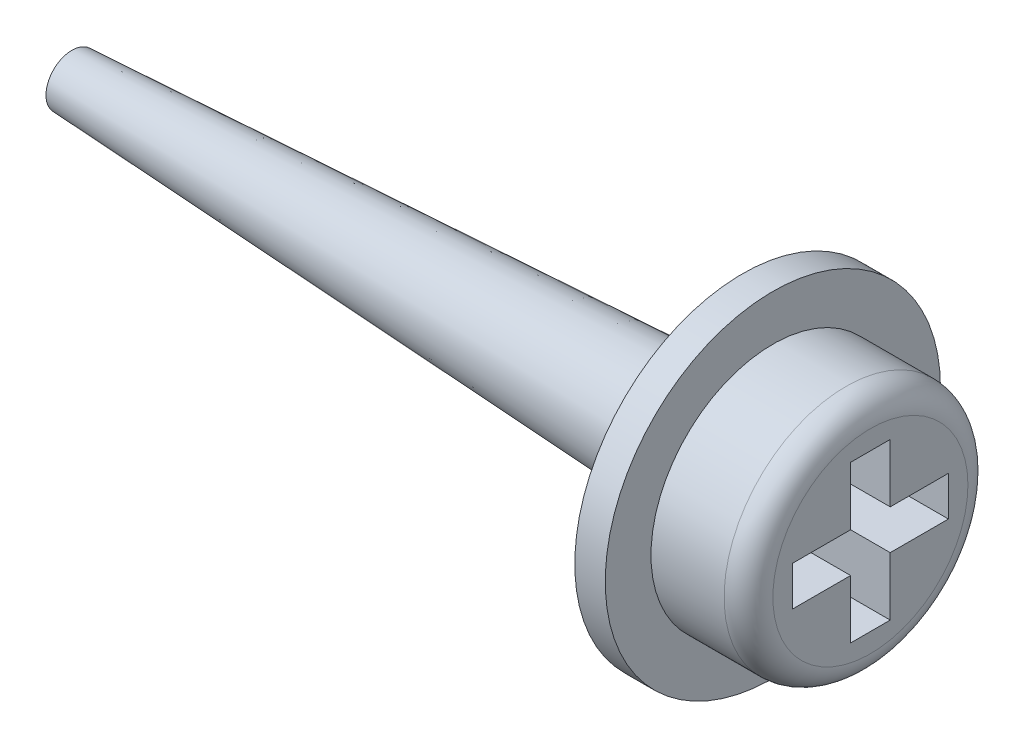
ISO-10303-21;
HEADER;
FILE_DESCRIPTION(('STEP AP214'),'2;1');
FILE_NAME('part.step','',(''),(''),'','','');
FILE_SCHEMA(('AUTOMOTIVE_DESIGN { 1 0 10303 214 1 1 1 1 }'));
ENDSEC;
DATA;
#1=APPLICATION_CONTEXT('core data for automotive mechanical design processes');
#2=APPLICATION_PROTOCOL_DEFINITION('international standard','automotive_design',2000,#1);
#3=PRODUCT_CONTEXT('',#1,'mechanical');
#4=PRODUCT('Part','Part','',(#3));
#5=PRODUCT_RELATED_PRODUCT_CATEGORY('part','',(#4));
#6=PRODUCT_DEFINITION_FORMATION('','',#4);
#7=PRODUCT_DEFINITION_CONTEXT('part definition',#1,'design');
#8=PRODUCT_DEFINITION('design','',#6,#7);
#9=PRODUCT_DEFINITION_SHAPE('','',#8);
#10=(LENGTH_UNIT() NAMED_UNIT(*) SI_UNIT(.MILLI.,.METRE.));
#11=(NAMED_UNIT(*) PLANE_ANGLE_UNIT() SI_UNIT($,.RADIAN.));
#12=(NAMED_UNIT(*) SI_UNIT($,.STERADIAN.) SOLID_ANGLE_UNIT());
#13=UNCERTAINTY_MEASURE_WITH_UNIT(LENGTH_MEASURE(1.E-05),#10,'distance_accuracy_value','');
#14=(GEOMETRIC_REPRESENTATION_CONTEXT(3) GLOBAL_UNCERTAINTY_ASSIGNED_CONTEXT((#13)) GLOBAL_UNIT_ASSIGNED_CONTEXT((#10,
#11,#12)) REPRESENTATION_CONTEXT('',''));
#15=CARTESIAN_POINT('',(0.,0.,0.));
#16=DIRECTION('',(0.,0.,1.));
#17=DIRECTION('',(1.,0.,0.));
#18=AXIS2_PLACEMENT_3D('',#15,#16,#17);
#19=CARTESIAN_POINT('',(-3.01819672131147,0.,0.));
#20=DIRECTION('',(-1.,0.,0.));
#21=DIRECTION('',(0.,0.,1.));
#22=AXIS2_PLACEMENT_3D('',#19,#20,#21);
#23=PLANE('',#22);
#24=CARTESIAN_POINT('',(-3.01819672131147,0.,0.));
#25=DIRECTION('',(-1.,0.,0.));
#26=DIRECTION('',(0.,0.,1.));
#27=AXIS2_PLACEMENT_3D('',#24,#25,#26);
#28=CIRCLE('',#27,0.51);
#29=CARTESIAN_POINT('',(-3.01819672131147,0.,0.51));
#30=VERTEX_POINT('',#29);
#31=EDGE_CURVE('E288',#30,#30,#28,.T.);
#32=ORIENTED_EDGE('',*,*,#31,.T.);
#33=EDGE_LOOP('',(#32));
#34=FACE_BOUND('',#33,.T.);
#35=ADVANCED_FACE('F41',(#34),#23,.T.);
#36=CARTESIAN_POINT('',(-3.01819672131147,0.,0.));
#37=DIRECTION('',(1.,0.,0.));
#38=DIRECTION('',(0.,0.,-1.));
#39=AXIS2_PLACEMENT_3D('',#36,#37,#38);
#40=CONICAL_SURFACE('',#39,0.51,0.0522251945142065);
#41=CARTESIAN_POINT('',(10.1818032786885,0.,0.));
#42=DIRECTION('',(-1.,0.,0.));
#43=DIRECTION('',(0.,0.,1.));
#44=AXIS2_PLACEMENT_3D('',#41,#42,#43);
#45=CIRCLE('',#44,1.2);
#46=CARTESIAN_POINT('',(10.1818032786885,0.,1.2));
#47=VERTEX_POINT('',#46);
#48=EDGE_CURVE('E293',#47,#47,#45,.T.);
#49=ORIENTED_EDGE('',*,*,#48,.T.);
#50=EDGE_LOOP('',(#49));
#51=FACE_BOUND('',#50,.T.);
#52=ORIENTED_EDGE('',*,*,#31,.F.);
#53=EDGE_LOOP('',(#52));
#54=FACE_BOUND('',#53,.T.);
#55=ADVANCED_FACE('F364',(#51,#54),#40,.T.);
#56=CARTESIAN_POINT('',(10.7818032786885,0.,0.));
#57=DIRECTION('',(-1.,0.,0.));
#58=DIRECTION('',(0.,0.,1.));
#59=AXIS2_PLACEMENT_3D('',#56,#57,#58);
#60=CYLINDRICAL_SURFACE('',#59,3.3);
#61=CARTESIAN_POINT('',(10.7818032786885,0.,0.));
#62=DIRECTION('',(1.,0.,0.));
#63=DIRECTION('',(0.,0.,-1.));
#64=AXIS2_PLACEMENT_3D('',#61,#62,#63);
#65=CIRCLE('',#64,3.3);
#66=CARTESIAN_POINT('',(10.7818032786885,0.,-3.3));
#67=VERTEX_POINT('',#66);
#68=EDGE_CURVE('E289',#67,#67,#65,.T.);
#69=ORIENTED_EDGE('',*,*,#68,.F.);
#70=EDGE_LOOP('',(#69));
#71=FACE_BOUND('',#70,.T.);
#72=CARTESIAN_POINT('',(10.1818032786885,0.,0.));
#73=DIRECTION('',(1.,0.,0.));
#74=DIRECTION('',(0.,0.,-1.));
#75=AXIS2_PLACEMENT_3D('',#72,#73,#74);
#76=CIRCLE('',#75,3.3);
#77=CARTESIAN_POINT('',(10.1818032786885,0.,-3.3));
#78=VERTEX_POINT('',#77);
#79=EDGE_CURVE('E255',#78,#78,#76,.T.);
#80=ORIENTED_EDGE('',*,*,#79,.T.);
#81=EDGE_LOOP('',(#80));
#82=FACE_BOUND('',#81,.T.);
#83=ADVANCED_FACE('F370',(#71,#82),#60,.T.);
#84=CARTESIAN_POINT('',(10.7818032786885,0.,0.));
#85=DIRECTION('',(1.,0.,0.));
#86=DIRECTION('',(0.,0.,-1.));
#87=AXIS2_PLACEMENT_3D('',#84,#85,#86);
#88=PLANE('',#87);
#89=CARTESIAN_POINT('',(10.7818032786885,0.,0.));
#90=DIRECTION('',(1.,0.,0.));
#91=DIRECTION('',(0.,0.,-1.));
#92=AXIS2_PLACEMENT_3D('',#89,#90,#91);
#93=CIRCLE('',#92,2.4);
#94=CARTESIAN_POINT('',(10.7818032786885,0.,-2.4));
#95=VERTEX_POINT('',#94);
#96=EDGE_CURVE('E283',#95,#95,#93,.T.);
#97=ORIENTED_EDGE('',*,*,#96,.F.);
#98=EDGE_LOOP('',(#97));
#99=FACE_BOUND('',#98,.T.);
#100=ORIENTED_EDGE('',*,*,#68,.T.);
#101=EDGE_LOOP('',(#100));
#102=FACE_BOUND('',#101,.T.);
#103=ADVANCED_FACE('F424',(#99,#102),#88,.T.);
#104=CARTESIAN_POINT('',(10.1818032786885,0.,0.));
#105=DIRECTION('',(1.,0.,0.));
#106=DIRECTION('',(0.,0.,-1.));
#107=AXIS2_PLACEMENT_3D('',#104,#105,#106);
#108=PLANE('',#107);
#109=ORIENTED_EDGE('',*,*,#48,.F.);
#110=EDGE_LOOP('',(#109));
#111=FACE_BOUND('',#110,.T.);
#112=ORIENTED_EDGE('',*,*,#79,.F.);
#113=EDGE_LOOP('',(#112));
#114=FACE_BOUND('',#113,.T.);
#115=ADVANCED_FACE('F422',(#111,#114),#108,.F.);
#116=CARTESIAN_POINT('',(12.7018032786885,0.,0.));
#117=DIRECTION('',(-1.,0.,0.));
#118=DIRECTION('',(0.,0.,1.));
#119=AXIS2_PLACEMENT_3D('',#116,#117,#118);
#120=CYLINDRICAL_SURFACE('',#119,2.4);
#121=CARTESIAN_POINT('',(12.2218032786885,0.,0.));
#122=DIRECTION('',(1.,0.,0.));
#123=DIRECTION('',(0.,0.,-1.));
#124=AXIS2_PLACEMENT_3D('',#121,#122,#123);
#125=CIRCLE('',#124,2.4);
#126=CARTESIAN_POINT('',(12.2218032786885,0.,-2.4));
#127=VERTEX_POINT('',#126);
#128=EDGE_CURVE('E11',#127,#127,#125,.F.);
#129=ORIENTED_EDGE('',*,*,#128,.T.);
#130=EDGE_LOOP('',(#129));
#131=FACE_BOUND('',#130,.T.);
#132=ORIENTED_EDGE('',*,*,#96,.T.);
#133=EDGE_LOOP('',(#132));
#134=FACE_BOUND('',#133,.T.);
#135=ADVANCED_FACE('F419',(#131,#134),#120,.T.);
#136=CARTESIAN_POINT('',(12.7018032786885,0.,0.));
#137=DIRECTION('',(1.,0.,0.));
#138=DIRECTION('',(0.,0.,-1.));
#139=AXIS2_PLACEMENT_3D('',#136,#137,#138);
#140=PLANE('',#139);
#141=CARTESIAN_POINT('',(12.7018032786885,0.,0.));
#142=DIRECTION('',(1.,0.,0.));
#143=DIRECTION('',(0.,0.,-1.));
#144=AXIS2_PLACEMENT_3D('',#141,#142,#143);
#145=CIRCLE('',#144,1.92);
#146=CARTESIAN_POINT('',(12.7018032786885,0.,-1.92));
#147=VERTEX_POINT('',#146);
#148=EDGE_CURVE('E50',#147,#147,#145,.T.);
#149=ORIENTED_EDGE('',*,*,#148,.T.);
#150=EDGE_LOOP('',(#149));
#151=FACE_BOUND('',#150,.T.);
#152=DIRECTION('',(0.,0.,-1.));
#153=VECTOR('',#152,1.);
#154=CARTESIAN_POINT('',(12.7018032786885,-0.39,-0.390000000000001));
#155=LINE('',#154,#153);
#156=CARTESIAN_POINT('',(12.7018032786885,-0.39,-0.390000000000001));
#157=VERTEX_POINT('',#156);
#158=CARTESIAN_POINT('',(12.7018032786885,-0.39,-1.536));
#159=VERTEX_POINT('',#158);
#160=EDGE_CURVE('E207',#157,#159,#155,.T.);
#161=ORIENTED_EDGE('',*,*,#160,.F.);
#162=DIRECTION('',(0.,1.,0.));
#163=VECTOR('',#162,1.);
#164=CARTESIAN_POINT('',(12.7018032786885,-1.54,-0.390000000000001));
#165=LINE('',#164,#163);
#166=CARTESIAN_POINT('',(12.7018032786885,-1.54,-0.390000000000001));
#167=VERTEX_POINT('',#166);
#168=EDGE_CURVE('E248',#167,#157,#165,.T.);
#169=ORIENTED_EDGE('',*,*,#168,.F.);
#170=DIRECTION('',(0.,0.,-1.));
#171=VECTOR('',#170,1.);
#172=CARTESIAN_POINT('',(12.7018032786885,-1.54,0.389999999999999));
#173=LINE('',#172,#171);
#174=CARTESIAN_POINT('',(12.7018032786885,-1.54,0.389999999999999));
#175=VERTEX_POINT('',#174);
#176=EDGE_CURVE('E244',#175,#167,#173,.T.);
#177=ORIENTED_EDGE('',*,*,#176,.F.);
#178=DIRECTION('',(0.,-1.,0.));
#179=VECTOR('',#178,1.);
#180=CARTESIAN_POINT('',(12.7018032786885,-1.54,0.389999999999999));
#181=LINE('',#180,#179);
#182=CARTESIAN_POINT('',(12.7018032786885,-0.39,0.39));
#183=VERTEX_POINT('',#182);
#184=EDGE_CURVE('E240',#183,#175,#181,.T.);
#185=ORIENTED_EDGE('',*,*,#184,.F.);
#186=DIRECTION('',(0.,0.,-1.));
#187=VECTOR('',#186,1.);
#188=CARTESIAN_POINT('',(12.7018032786885,-0.39,0.39));
#189=LINE('',#188,#187);
#190=CARTESIAN_POINT('',(12.7018032786885,-0.39,1.536));
#191=VERTEX_POINT('',#190);
#192=EDGE_CURVE('E236',#191,#183,#189,.T.);
#193=ORIENTED_EDGE('',*,*,#192,.F.);
#194=DIRECTION('',(0.,-1.,0.));
#195=VECTOR('',#194,1.);
#196=CARTESIAN_POINT('',(12.7018032786885,0.39,1.536));
#197=LINE('',#196,#195);
#198=CARTESIAN_POINT('',(12.7018032786885,0.39,1.536));
#199=VERTEX_POINT('',#198);
#200=EDGE_CURVE('E232',#199,#191,#197,.T.);
#201=ORIENTED_EDGE('',*,*,#200,.F.);
#202=DIRECTION('',(0.,0.,1.));
#203=VECTOR('',#202,1.);
#204=CARTESIAN_POINT('',(12.7018032786885,0.39,0.39));
#205=LINE('',#204,#203);
#206=CARTESIAN_POINT('',(12.7018032786885,0.39,0.39));
#207=VERTEX_POINT('',#206);
#208=EDGE_CURVE('E228',#207,#199,#205,.T.);
#209=ORIENTED_EDGE('',*,*,#208,.F.);
#210=DIRECTION('',(0.,-1.,0.));
#211=VECTOR('',#210,1.);
#212=CARTESIAN_POINT('',(12.7018032786885,1.54,0.39));
#213=LINE('',#212,#211);
#214=CARTESIAN_POINT('',(12.7018032786885,1.54,0.39));
#215=VERTEX_POINT('',#214);
#216=EDGE_CURVE('E224',#215,#207,#213,.T.);
#217=ORIENTED_EDGE('',*,*,#216,.F.);
#218=DIRECTION('',(0.,0.,1.));
#219=VECTOR('',#218,1.);
#220=CARTESIAN_POINT('',(12.7018032786885,1.54,0.39));
#221=LINE('',#220,#219);
#222=CARTESIAN_POINT('',(12.7018032786885,1.54,-0.390000000000001));
#223=VERTEX_POINT('',#222);
#224=EDGE_CURVE('E220',#223,#215,#221,.T.);
#225=ORIENTED_EDGE('',*,*,#224,.F.);
#226=DIRECTION('',(0.,1.,0.));
#227=VECTOR('',#226,1.);
#228=CARTESIAN_POINT('',(12.7018032786885,1.54,-0.390000000000001));
#229=LINE('',#228,#227);
#230=CARTESIAN_POINT('',(12.7018032786885,0.39,-0.390000000000001));
#231=VERTEX_POINT('',#230);
#232=EDGE_CURVE('E217',#231,#223,#229,.T.);
#233=ORIENTED_EDGE('',*,*,#232,.F.);
#234=DIRECTION('',(0.,0.,1.));
#235=VECTOR('',#234,1.);
#236=CARTESIAN_POINT('',(12.7018032786885,0.39,-0.390000000000001));
#237=LINE('',#236,#235);
#238=CARTESIAN_POINT('',(12.7018032786885,0.39,-1.536));
#239=VERTEX_POINT('',#238);
#240=EDGE_CURVE('E175',#239,#231,#237,.T.);
#241=ORIENTED_EDGE('',*,*,#240,.F.);
#242=DIRECTION('',(0.,1.,0.));
#243=VECTOR('',#242,1.);
#244=CARTESIAN_POINT('',(12.7018032786885,0.39,-1.536));
#245=LINE('',#244,#243);
#246=EDGE_CURVE('E211',#159,#239,#245,.T.);
#247=ORIENTED_EDGE('',*,*,#246,.F.);
#248=EDGE_LOOP('',(#161,#169,#177,#185,#193,#201,#209,#217,#225,#233,#241,#247));
#249=FACE_BOUND('',#248,.T.);
#250=ADVANCED_FACE('F351',(#151,#249),#140,.T.);
#251=CARTESIAN_POINT('',(10.7818032786885,-0.39,-0.390000000000001));
#252=DIRECTION('',(0.,-1.,0.));
#253=DIRECTION('',(0.,0.,-1.));
#254=AXIS2_PLACEMENT_3D('',#251,#252,#253);
#255=PLANE('',#254);
#256=DIRECTION('',(1.,0.,0.));
#257=VECTOR('',#256,1.);
#258=CARTESIAN_POINT('',(10.7818032786885,-0.39,-1.536));
#259=LINE('',#258,#257);
#260=CARTESIAN_POINT('',(11.1418032786885,-0.39,-1.536));
#261=VERTEX_POINT('',#260);
#262=EDGE_CURVE('E206',#261,#159,#259,.T.);
#263=ORIENTED_EDGE('',*,*,#262,.F.);
#264=CARTESIAN_POINT('',(11.1418032786885,-0.39,-1.176));
#265=DIRECTION('',(0.,-1.,0.));
#266=DIRECTION('',(0.,0.,-1.));
#267=AXIS2_PLACEMENT_3D('',#264,#265,#266);
#268=CIRCLE('',#267,0.36);
#269=CARTESIAN_POINT('',(10.7818032786885,-0.39,-1.176));
#270=VERTEX_POINT('',#269);
#271=EDGE_CURVE('E339',#261,#270,#268,.F.);
#272=ORIENTED_EDGE('',*,*,#271,.T.);
#273=DIRECTION('',(0.,0.,-1.));
#274=VECTOR('',#273,1.);
#275=CARTESIAN_POINT('',(10.7818032786885,-0.39,-0.390000000000001));
#276=LINE('',#275,#274);
#277=CARTESIAN_POINT('',(10.7818032786885,-0.39,-0.390000000000001));
#278=VERTEX_POINT('',#277);
#279=EDGE_CURVE('E169',#278,#270,#276,.T.);
#280=ORIENTED_EDGE('',*,*,#279,.F.);
#281=DIRECTION('',(1.,0.,0.));
#282=VECTOR('',#281,1.);
#283=CARTESIAN_POINT('',(10.7818032786885,-0.39,-0.390000000000001));
#284=LINE('',#283,#282);
#285=EDGE_CURVE('E252',#278,#157,#284,.T.);
#286=ORIENTED_EDGE('',*,*,#285,.T.);
#287=ORIENTED_EDGE('',*,*,#160,.T.);
#288=EDGE_LOOP('',(#263,#272,#280,#286,#287));
#289=FACE_BOUND('',#288,.T.);
#290=ADVANCED_FACE('F392',(#289),#255,.F.);
#291=CARTESIAN_POINT('',(10.7818032786885,-1.54,-0.390000000000001));
#292=DIRECTION('',(0.,0.,-1.));
#293=DIRECTION('',(0.,1.,0.));
#294=AXIS2_PLACEMENT_3D('',#291,#292,#293);
#295=PLANE('',#294);
#296=DIRECTION('',(0.,1.,0.));
#297=VECTOR('',#296,1.);
#298=CARTESIAN_POINT('',(10.7818032786885,-1.54,-0.390000000000001));
#299=LINE('',#298,#297);
#300=CARTESIAN_POINT('',(10.7818032786885,-1.18,-0.390000000000001));
#301=VERTEX_POINT('',#300);
#302=EDGE_CURVE('E203',#301,#278,#299,.T.);
#303=ORIENTED_EDGE('',*,*,#302,.F.);
#304=CARTESIAN_POINT('',(11.1418032786885,-1.18,-0.390000000000001));
#305=DIRECTION('',(0.,0.,-1.));
#306=DIRECTION('',(0.,1.,0.));
#307=AXIS2_PLACEMENT_3D('',#304,#305,#306);
#308=CIRCLE('',#307,0.36);
#309=CARTESIAN_POINT('',(11.1418032786885,-1.54,-0.390000000000001));
#310=VERTEX_POINT('',#309);
#311=EDGE_CURVE('E315',#301,#310,#308,.F.);
#312=ORIENTED_EDGE('',*,*,#311,.T.);
#313=DIRECTION('',(1.,0.,0.));
#314=VECTOR('',#313,1.);
#315=CARTESIAN_POINT('',(10.7818032786885,-1.54,-0.390000000000001));
#316=LINE('',#315,#314);
#317=EDGE_CURVE('E256',#310,#167,#316,.T.);
#318=ORIENTED_EDGE('',*,*,#317,.T.);
#319=ORIENTED_EDGE('',*,*,#168,.T.);
#320=ORIENTED_EDGE('',*,*,#285,.F.);
#321=EDGE_LOOP('',(#303,#312,#318,#319,#320));
#322=FACE_BOUND('',#321,.T.);
#323=ADVANCED_FACE('F398',(#322),#295,.F.);
#324=CARTESIAN_POINT('',(10.7818032786885,-1.54,0.389999999999999));
#325=DIRECTION('',(0.,-1.,0.));
#326=DIRECTION('',(0.,0.,-1.));
#327=AXIS2_PLACEMENT_3D('',#324,#325,#326);
#328=PLANE('',#327);
#329=ORIENTED_EDGE('',*,*,#317,.F.);
#330=DIRECTION('',(0.,0.,-1.));
#331=VECTOR('',#330,1.);
#332=CARTESIAN_POINT('',(11.1418032786885,-1.54,0.389999999999999));
#333=LINE('',#332,#331);
#334=CARTESIAN_POINT('',(11.1418032786885,-1.54,0.389999999999999));
#335=VERTEX_POINT('',#334);
#336=EDGE_CURVE('E318',#310,#335,#333,.F.);
#337=ORIENTED_EDGE('',*,*,#336,.T.);
#338=DIRECTION('',(1.,0.,0.));
#339=VECTOR('',#338,1.);
#340=CARTESIAN_POINT('',(10.7818032786885,-1.54,0.389999999999999));
#341=LINE('',#340,#339);
#342=EDGE_CURVE('E259',#335,#175,#341,.T.);
#343=ORIENTED_EDGE('',*,*,#342,.T.);
#344=ORIENTED_EDGE('',*,*,#176,.T.);
#345=EDGE_LOOP('',(#329,#337,#343,#344));
#346=FACE_BOUND('',#345,.T.);
#347=ADVANCED_FACE('F468',(#346),#328,.F.);
#348=CARTESIAN_POINT('',(10.7818032786885,-1.54,0.389999999999999));
#349=DIRECTION('',(0.,0.,1.));
#350=DIRECTION('',(0.,-1.,0.));
#351=AXIS2_PLACEMENT_3D('',#348,#349,#350);
#352=PLANE('',#351);
#353=ORIENTED_EDGE('',*,*,#342,.F.);
#354=CARTESIAN_POINT('',(11.1418032786885,-1.18,0.389999999999999));
#355=DIRECTION('',(0.,0.,1.));
#356=DIRECTION('',(0.,-1.,0.));
#357=AXIS2_PLACEMENT_3D('',#354,#355,#356);
#358=CIRCLE('',#357,0.36);
#359=CARTESIAN_POINT('',(10.7818032786885,-1.18,0.389999999999999));
#360=VERTEX_POINT('',#359);
#361=EDGE_CURVE('E321',#335,#360,#358,.F.);
#362=ORIENTED_EDGE('',*,*,#361,.T.);
#363=DIRECTION('',(0.,-1.,0.));
#364=VECTOR('',#363,1.);
#365=CARTESIAN_POINT('',(10.7818032786885,-1.54,0.389999999999999));
#366=LINE('',#365,#364);
#367=CARTESIAN_POINT('',(10.7818032786885,-0.39,0.39));
#368=VERTEX_POINT('',#367);
#369=EDGE_CURVE('E200',#368,#360,#366,.T.);
#370=ORIENTED_EDGE('',*,*,#369,.F.);
#371=DIRECTION('',(1.,0.,0.));
#372=VECTOR('',#371,1.);
#373=CARTESIAN_POINT('',(10.7818032786885,-0.39,0.39));
#374=LINE('',#373,#372);
#375=EDGE_CURVE('E262',#368,#183,#374,.T.);
#376=ORIENTED_EDGE('',*,*,#375,.T.);
#377=ORIENTED_EDGE('',*,*,#184,.T.);
#378=EDGE_LOOP('',(#353,#362,#370,#376,#377));
#379=FACE_BOUND('',#378,.T.);
#380=ADVANCED_FACE('F475',(#379),#352,.F.);
#381=CARTESIAN_POINT('',(10.7818032786885,-0.39,0.39));
#382=DIRECTION('',(0.,-1.,0.));
#383=DIRECTION('',(0.,0.,-1.));
#384=AXIS2_PLACEMENT_3D('',#381,#382,#383);
#385=PLANE('',#384);
#386=DIRECTION('',(0.,0.,-1.));
#387=VECTOR('',#386,1.);
#388=CARTESIAN_POINT('',(10.7818032786885,-0.39,0.39));
#389=LINE('',#388,#387);
#390=CARTESIAN_POINT('',(10.7818032786885,-0.39,1.176));
#391=VERTEX_POINT('',#390);
#392=EDGE_CURVE('E197',#391,#368,#389,.T.);
#393=ORIENTED_EDGE('',*,*,#392,.F.);
#394=CARTESIAN_POINT('',(11.1418032786885,-0.39,1.176));
#395=DIRECTION('',(0.,-1.,0.));
#396=DIRECTION('',(0.,0.,-1.));
#397=AXIS2_PLACEMENT_3D('',#394,#395,#396);
#398=CIRCLE('',#397,0.36);
#399=CARTESIAN_POINT('',(11.1418032786885,-0.39,1.536));
#400=VERTEX_POINT('',#399);
#401=EDGE_CURVE('E324',#391,#400,#398,.F.);
#402=ORIENTED_EDGE('',*,*,#401,.T.);
#403=DIRECTION('',(1.,0.,0.));
#404=VECTOR('',#403,1.);
#405=CARTESIAN_POINT('',(10.7818032786885,-0.39,1.536));
#406=LINE('',#405,#404);
#407=EDGE_CURVE('E265',#400,#191,#406,.T.);
#408=ORIENTED_EDGE('',*,*,#407,.T.);
#409=ORIENTED_EDGE('',*,*,#192,.T.);
#410=ORIENTED_EDGE('',*,*,#375,.F.);
#411=EDGE_LOOP('',(#393,#402,#408,#409,#410));
#412=FACE_BOUND('',#411,.T.);
#413=ADVANCED_FACE('F483',(#412),#385,.F.);
#414=CARTESIAN_POINT('',(10.7818032786885,0.39,1.536));
#415=DIRECTION('',(0.,0.,1.));
#416=DIRECTION('',(1.,0.,0.));
#417=AXIS2_PLACEMENT_3D('',#414,#415,#416);
#418=PLANE('',#417);
#419=ORIENTED_EDGE('',*,*,#407,.F.);
#420=DIRECTION('',(0.,-1.,0.));
#421=VECTOR('',#420,1.);
#422=CARTESIAN_POINT('',(11.1418032786885,0.39,1.536));
#423=LINE('',#422,#421);
#424=CARTESIAN_POINT('',(11.1418032786885,0.39,1.536));
#425=VERTEX_POINT('',#424);
#426=EDGE_CURVE('E327',#400,#425,#423,.F.);
#427=ORIENTED_EDGE('',*,*,#426,.T.);
#428=DIRECTION('',(1.,0.,0.));
#429=VECTOR('',#428,1.);
#430=CARTESIAN_POINT('',(10.7818032786885,0.39,1.536));
#431=LINE('',#430,#429);
#432=EDGE_CURVE('E268',#425,#199,#431,.T.);
#433=ORIENTED_EDGE('',*,*,#432,.T.);
#434=ORIENTED_EDGE('',*,*,#200,.T.);
#435=EDGE_LOOP('',(#419,#427,#433,#434));
#436=FACE_BOUND('',#435,.T.);
#437=ADVANCED_FACE('F491',(#436),#418,.F.);
#438=CARTESIAN_POINT('',(10.7818032786885,0.39,0.39));
#439=DIRECTION('',(0.,1.,0.));
#440=DIRECTION('',(0.,0.,1.));
#441=AXIS2_PLACEMENT_3D('',#438,#439,#440);
#442=PLANE('',#441);
#443=ORIENTED_EDGE('',*,*,#432,.F.);
#444=CARTESIAN_POINT('',(11.1418032786885,0.39,1.176));
#445=DIRECTION('',(0.,1.,0.));
#446=DIRECTION('',(0.,0.,1.));
#447=AXIS2_PLACEMENT_3D('',#444,#445,#446);
#448=CIRCLE('',#447,0.36);
#449=CARTESIAN_POINT('',(10.7818032786885,0.39,1.176));
#450=VERTEX_POINT('',#449);
#451=EDGE_CURVE('E330',#425,#450,#448,.F.);
#452=ORIENTED_EDGE('',*,*,#451,.T.);
#453=DIRECTION('',(0.,0.,1.));
#454=VECTOR('',#453,1.);
#455=CARTESIAN_POINT('',(10.7818032786885,0.39,0.39));
#456=LINE('',#455,#454);
#457=CARTESIAN_POINT('',(10.7818032786885,0.39,0.39));
#458=VERTEX_POINT('',#457);
#459=EDGE_CURVE('E190',#458,#450,#456,.T.);
#460=ORIENTED_EDGE('',*,*,#459,.F.);
#461=DIRECTION('',(1.,0.,0.));
#462=VECTOR('',#461,1.);
#463=CARTESIAN_POINT('',(10.7818032786885,0.39,0.39));
#464=LINE('',#463,#462);
#465=EDGE_CURVE('E271',#458,#207,#464,.T.);
#466=ORIENTED_EDGE('',*,*,#465,.T.);
#467=ORIENTED_EDGE('',*,*,#208,.T.);
#468=EDGE_LOOP('',(#443,#452,#460,#466,#467));
#469=FACE_BOUND('',#468,.T.);
#470=ADVANCED_FACE('F499',(#469),#442,.F.);
#471=CARTESIAN_POINT('',(10.7818032786885,1.54,0.39));
#472=DIRECTION('',(0.,0.,1.));
#473=DIRECTION('',(0.,-1.,0.));
#474=AXIS2_PLACEMENT_3D('',#471,#472,#473);
#475=PLANE('',#474);
#476=DIRECTION('',(0.,-1.,0.));
#477=VECTOR('',#476,1.);
#478=CARTESIAN_POINT('',(10.7818032786885,1.54,0.39));
#479=LINE('',#478,#477);
#480=CARTESIAN_POINT('',(10.7818032786885,1.18,0.39));
#481=VERTEX_POINT('',#480);
#482=EDGE_CURVE('E187',#481,#458,#479,.T.);
#483=ORIENTED_EDGE('',*,*,#482,.F.);
#484=CARTESIAN_POINT('',(11.1418032786885,1.18,0.39));
#485=DIRECTION('',(0.,0.,1.));
#486=DIRECTION('',(0.,-1.,0.));
#487=AXIS2_PLACEMENT_3D('',#484,#485,#486);
#488=CIRCLE('',#487,0.36);
#489=CARTESIAN_POINT('',(11.1418032786885,1.54,0.39));
#490=VERTEX_POINT('',#489);
#491=EDGE_CURVE('E65',#481,#490,#488,.F.);
#492=ORIENTED_EDGE('',*,*,#491,.T.);
#493=DIRECTION('',(1.,0.,0.));
#494=VECTOR('',#493,1.);
#495=CARTESIAN_POINT('',(10.7818032786885,1.54,0.39));
#496=LINE('',#495,#494);
#497=EDGE_CURVE('E274',#490,#215,#496,.T.);
#498=ORIENTED_EDGE('',*,*,#497,.T.);
#499=ORIENTED_EDGE('',*,*,#216,.T.);
#500=ORIENTED_EDGE('',*,*,#465,.F.);
#501=EDGE_LOOP('',(#483,#492,#498,#499,#500));
#502=FACE_BOUND('',#501,.T.);
#503=ADVANCED_FACE('F507',(#502),#475,.F.);
#504=CARTESIAN_POINT('',(10.7818032786885,1.54,0.39));
#505=DIRECTION('',(0.,1.,0.));
#506=DIRECTION('',(0.,0.,1.));
#507=AXIS2_PLACEMENT_3D('',#504,#505,#506);
#508=PLANE('',#507);
#509=ORIENTED_EDGE('',*,*,#497,.F.);
#510=DIRECTION('',(0.,0.,1.));
#511=VECTOR('',#510,1.);
#512=CARTESIAN_POINT('',(11.1418032786885,1.54,-0.390000000000001));
#513=LINE('',#512,#511);
#514=CARTESIAN_POINT('',(11.1418032786885,1.54,-0.390000000000001));
#515=VERTEX_POINT('',#514);
#516=EDGE_CURVE('E57',#490,#515,#513,.F.);
#517=ORIENTED_EDGE('',*,*,#516,.T.);
#518=DIRECTION('',(1.,0.,0.));
#519=VECTOR('',#518,1.);
#520=CARTESIAN_POINT('',(10.7818032786885,1.54,-0.390000000000001));
#521=LINE('',#520,#519);
#522=EDGE_CURVE('E180',#515,#223,#521,.T.);
#523=ORIENTED_EDGE('',*,*,#522,.T.);
#524=ORIENTED_EDGE('',*,*,#224,.T.);
#525=EDGE_LOOP('',(#509,#517,#523,#524));
#526=FACE_BOUND('',#525,.T.);
#527=ADVANCED_FACE('F515',(#526),#508,.F.);
#528=CARTESIAN_POINT('',(10.7818032786885,1.54,-0.390000000000001));
#529=DIRECTION('',(0.,0.,-1.));
#530=DIRECTION('',(0.,1.,0.));
#531=AXIS2_PLACEMENT_3D('',#528,#529,#530);
#532=PLANE('',#531);
#533=ORIENTED_EDGE('',*,*,#522,.F.);
#534=CARTESIAN_POINT('',(11.1418032786885,1.18,-0.390000000000001));
#535=DIRECTION('',(0.,0.,-1.));
#536=DIRECTION('',(0.,1.,0.));
#537=AXIS2_PLACEMENT_3D('',#534,#535,#536);
#538=CIRCLE('',#537,0.36);
#539=CARTESIAN_POINT('',(10.7818032786885,1.18,-0.390000000000001));
#540=VERTEX_POINT('',#539);
#541=EDGE_CURVE('E185',#515,#540,#538,.F.);
#542=ORIENTED_EDGE('',*,*,#541,.T.);
#543=DIRECTION('',(0.,1.,0.));
#544=VECTOR('',#543,1.);
#545=CARTESIAN_POINT('',(10.7818032786885,1.54,-0.390000000000001));
#546=LINE('',#545,#544);
#547=CARTESIAN_POINT('',(10.7818032786885,0.39,-0.390000000000001));
#548=VERTEX_POINT('',#547);
#549=EDGE_CURVE('E162',#548,#540,#546,.T.);
#550=ORIENTED_EDGE('',*,*,#549,.F.);
#551=DIRECTION('',(1.,0.,0.));
#552=VECTOR('',#551,1.);
#553=CARTESIAN_POINT('',(10.7818032786885,0.39,-0.390000000000001));
#554=LINE('',#553,#552);
#555=EDGE_CURVE('E172',#548,#231,#554,.T.);
#556=ORIENTED_EDGE('',*,*,#555,.T.);
#557=ORIENTED_EDGE('',*,*,#232,.T.);
#558=EDGE_LOOP('',(#533,#542,#550,#556,#557));
#559=FACE_BOUND('',#558,.T.);
#560=ADVANCED_FACE('F183',(#559),#532,.F.);
#561=CARTESIAN_POINT('',(10.7818032786885,0.39,-0.390000000000001));
#562=DIRECTION('',(0.,1.,0.));
#563=DIRECTION('',(0.,0.,1.));
#564=AXIS2_PLACEMENT_3D('',#561,#562,#563);
#565=PLANE('',#564);
#566=DIRECTION('',(0.,0.,1.));
#567=VECTOR('',#566,1.);
#568=CARTESIAN_POINT('',(10.7818032786885,0.39,-0.390000000000001));
#569=LINE('',#568,#567);
#570=CARTESIAN_POINT('',(10.7818032786885,0.39,-1.176));
#571=VERTEX_POINT('',#570);
#572=EDGE_CURVE('E156',#571,#548,#569,.T.);
#573=ORIENTED_EDGE('',*,*,#572,.F.);
#574=CARTESIAN_POINT('',(11.1418032786885,0.39,-1.176));
#575=DIRECTION('',(0.,1.,0.));
#576=DIRECTION('',(0.,0.,1.));
#577=AXIS2_PLACEMENT_3D('',#574,#575,#576);
#578=CIRCLE('',#577,0.36);
#579=CARTESIAN_POINT('',(11.1418032786885,0.39,-1.536));
#580=VERTEX_POINT('',#579);
#581=EDGE_CURVE('E333',#571,#580,#578,.F.);
#582=ORIENTED_EDGE('',*,*,#581,.T.);
#583=DIRECTION('',(1.,0.,0.));
#584=VECTOR('',#583,1.);
#585=CARTESIAN_POINT('',(10.7818032786885,0.39,-1.536));
#586=LINE('',#585,#584);
#587=EDGE_CURVE('E181',#580,#239,#586,.T.);
#588=ORIENTED_EDGE('',*,*,#587,.T.);
#589=ORIENTED_EDGE('',*,*,#240,.T.);
#590=ORIENTED_EDGE('',*,*,#555,.F.);
#591=EDGE_LOOP('',(#573,#582,#588,#589,#590));
#592=FACE_BOUND('',#591,.T.);
#593=ADVANCED_FACE('F173',(#592),#565,.F.);
#594=CARTESIAN_POINT('',(10.7818032786885,0.39,-1.536));
#595=DIRECTION('',(0.,0.,-1.));
#596=DIRECTION('',(-1.,0.,0.));
#597=AXIS2_PLACEMENT_3D('',#594,#595,#596);
#598=PLANE('',#597);
#599=ORIENTED_EDGE('',*,*,#587,.F.);
#600=DIRECTION('',(0.,1.,0.));
#601=VECTOR('',#600,1.);
#602=CARTESIAN_POINT('',(11.1418032786885,-0.39,-1.536));
#603=LINE('',#602,#601);
#604=EDGE_CURVE('E336',#580,#261,#603,.F.);
#605=ORIENTED_EDGE('',*,*,#604,.T.);
#606=ORIENTED_EDGE('',*,*,#262,.T.);
#607=ORIENTED_EDGE('',*,*,#246,.T.);
#608=EDGE_LOOP('',(#599,#605,#606,#607));
#609=FACE_BOUND('',#608,.T.);
#610=ADVANCED_FACE('F404',(#609),#598,.F.);
#611=CARTESIAN_POINT('',(10.7818032786885,0.,0.));
#612=DIRECTION('',(-1.,0.,0.));
#613=DIRECTION('',(0.,0.,1.));
#614=AXIS2_PLACEMENT_3D('',#611,#612,#613);
#615=PLANE('',#614);
#616=ORIENTED_EDGE('',*,*,#369,.T.);
#617=DIRECTION('',(0.,0.,-1.));
#618=VECTOR('',#617,1.);
#619=CARTESIAN_POINT('',(10.7818032786885,-1.18,-0.390000000000001));
#620=LINE('',#619,#618);
#621=EDGE_CURVE('E311',#360,#301,#620,.T.);
#622=ORIENTED_EDGE('',*,*,#621,.T.);
#623=ORIENTED_EDGE('',*,*,#302,.T.);
#624=ORIENTED_EDGE('',*,*,#279,.T.);
#625=DIRECTION('',(0.,1.,0.));
#626=VECTOR('',#625,1.);
#627=CARTESIAN_POINT('',(10.7818032786885,0.39,-1.176));
#628=LINE('',#627,#626);
#629=EDGE_CURVE('E166',#270,#571,#628,.T.);
#630=ORIENTED_EDGE('',*,*,#629,.T.);
#631=ORIENTED_EDGE('',*,*,#572,.T.);
#632=ORIENTED_EDGE('',*,*,#549,.T.);
#633=DIRECTION('',(0.,0.,1.));
#634=VECTOR('',#633,1.);
#635=CARTESIAN_POINT('',(10.7818032786885,1.18,0.39));
#636=LINE('',#635,#634);
#637=EDGE_CURVE('E287',#540,#481,#636,.T.);
#638=ORIENTED_EDGE('',*,*,#637,.T.);
#639=ORIENTED_EDGE('',*,*,#482,.T.);
#640=ORIENTED_EDGE('',*,*,#459,.T.);
#641=DIRECTION('',(0.,-1.,0.));
#642=VECTOR('',#641,1.);
#643=CARTESIAN_POINT('',(10.7818032786885,-0.39,1.176));
#644=LINE('',#643,#642);
#645=EDGE_CURVE('E307',#450,#391,#644,.T.);
#646=ORIENTED_EDGE('',*,*,#645,.T.);
#647=ORIENTED_EDGE('',*,*,#392,.T.);
#648=EDGE_LOOP('',(#616,#622,#623,#624,#630,#631,#632,#638,#639,#640,#646,#647));
#649=FACE_BOUND('',#648,.T.);
#650=ADVANCED_FACE('F159',(#649),#615,.F.);
#651=CARTESIAN_POINT('',(11.1418032786885,-1.18,0.));
#652=DIRECTION('',(0.,0.,1.));
#653=DIRECTION('',(1.,0.,0.));
#654=AXIS2_PLACEMENT_3D('',#651,#652,#653);
#655=CYLINDRICAL_SURFACE('',#654,0.36);
#656=ORIENTED_EDGE('',*,*,#361,.F.);
#657=ORIENTED_EDGE('',*,*,#336,.F.);
#658=ORIENTED_EDGE('',*,*,#311,.F.);
#659=ORIENTED_EDGE('',*,*,#621,.F.);
#660=EDGE_LOOP('',(#656,#657,#658,#659));
#661=FACE_BOUND('',#660,.T.);
#662=ADVANCED_FACE('F375',(#661),#655,.F.);
#663=CARTESIAN_POINT('',(11.1418032786885,0.,1.176));
#664=DIRECTION('',(0.,1.,0.));
#665=DIRECTION('',(0.,0.,1.));
#666=AXIS2_PLACEMENT_3D('',#663,#664,#665);
#667=CYLINDRICAL_SURFACE('',#666,0.36);
#668=ORIENTED_EDGE('',*,*,#451,.F.);
#669=ORIENTED_EDGE('',*,*,#426,.F.);
#670=ORIENTED_EDGE('',*,*,#401,.F.);
#671=ORIENTED_EDGE('',*,*,#645,.F.);
#672=EDGE_LOOP('',(#668,#669,#670,#671));
#673=FACE_BOUND('',#672,.T.);
#674=ADVANCED_FACE('F378',(#673),#667,.F.);
#675=CARTESIAN_POINT('',(11.1418032786885,0.,-1.176));
#676=DIRECTION('',(0.,-1.,0.));
#677=DIRECTION('',(0.,0.,-1.));
#678=AXIS2_PLACEMENT_3D('',#675,#676,#677);
#679=CYLINDRICAL_SURFACE('',#678,0.36);
#680=ORIENTED_EDGE('',*,*,#271,.F.);
#681=ORIENTED_EDGE('',*,*,#604,.F.);
#682=ORIENTED_EDGE('',*,*,#581,.F.);
#683=ORIENTED_EDGE('',*,*,#629,.F.);
#684=EDGE_LOOP('',(#680,#681,#682,#683));
#685=FACE_BOUND('',#684,.T.);
#686=ADVANCED_FACE('F360',(#685),#679,.F.);
#687=CARTESIAN_POINT('',(11.1418032786885,1.18,0.));
#688=DIRECTION('',(0.,0.,-1.));
#689=DIRECTION('',(-1.,0.,0.));
#690=AXIS2_PLACEMENT_3D('',#687,#688,#689);
#691=CYLINDRICAL_SURFACE('',#690,0.36);
#692=ORIENTED_EDGE('',*,*,#541,.F.);
#693=ORIENTED_EDGE('',*,*,#516,.F.);
#694=ORIENTED_EDGE('',*,*,#491,.F.);
#695=ORIENTED_EDGE('',*,*,#637,.F.);
#696=EDGE_LOOP('',(#692,#693,#694,#695));
#697=FACE_BOUND('',#696,.T.);
#698=ADVANCED_FACE('F355',(#697),#691,.F.);
#699=CARTESIAN_POINT('',(12.2218032786885,0.,0.));
#700=DIRECTION('',(1.,0.,0.));
#701=DIRECTION('',(0.,0.,-1.));
#702=AXIS2_PLACEMENT_3D('',#699,#700,#701);
#703=TOROIDAL_SURFACE('',#702,1.92,0.48);
#704=ORIENTED_EDGE('',*,*,#128,.F.);
#705=EDGE_LOOP('',(#704));
#706=FACE_BOUND('',#705,.T.);
#707=ORIENTED_EDGE('',*,*,#148,.F.);
#708=EDGE_LOOP('',(#707));
#709=FACE_BOUND('',#708,.T.);
#710=ADVANCED_FACE('F43',(#706,#709),#703,.T.);
#711=CLOSED_SHELL('',(#35,#55,#83,#103,#115,#135,#250,#290,#323,#347,#380,#413,#437,#470,#503,
#527,#560,#593,#610,#650,#662,#674,#686,#698,#710));
#712=MANIFOLD_SOLID_BREP('B2',#711);
#713=ADVANCED_BREP_SHAPE_REPRESENTATION('',(#18,#712),#14);
#714=SHAPE_DEFINITION_REPRESENTATION(#9,#713);
ENDSEC;
END-ISO-10303-21;
